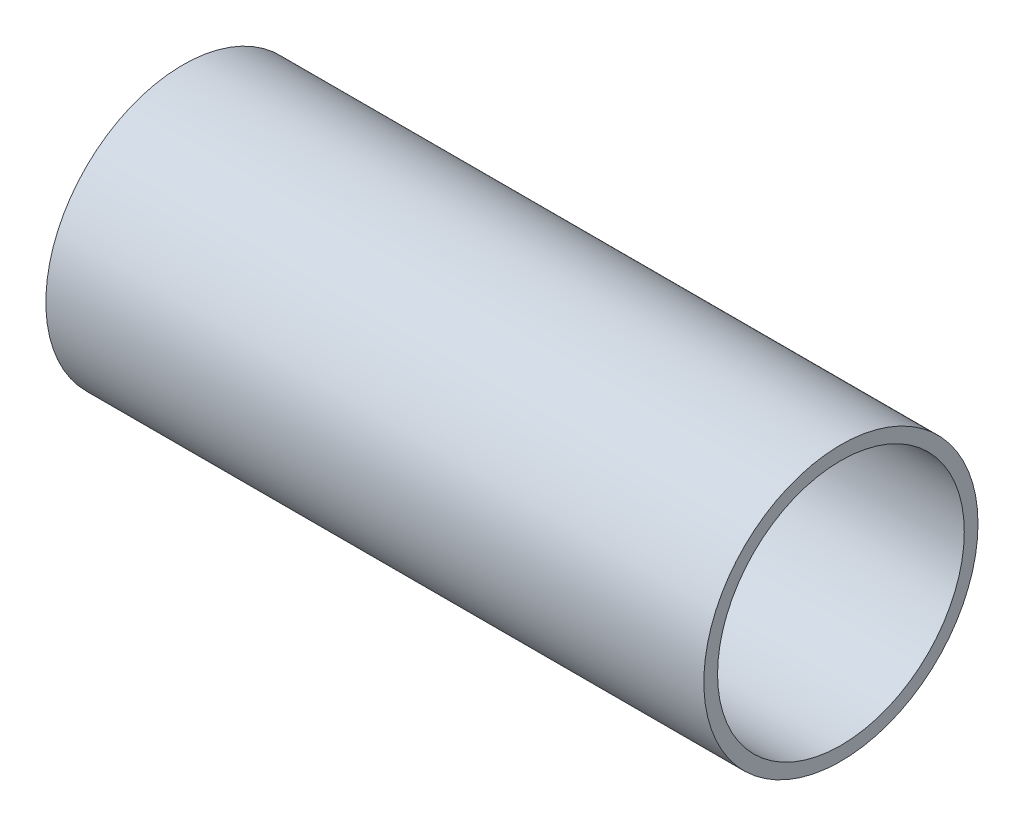
ISO-10303-21;
HEADER;
FILE_DESCRIPTION(('STEP AP214'),'2;1');
FILE_NAME('part.step','',(''),(''),'','','');
FILE_SCHEMA(('AUTOMOTIVE_DESIGN { 1 0 10303 214 1 1 1 1 }'));
ENDSEC;
DATA;
#1=APPLICATION_CONTEXT('core data for automotive mechanical design processes');
#2=APPLICATION_PROTOCOL_DEFINITION('international standard','automotive_design',2000,#1);
#3=PRODUCT_CONTEXT('',#1,'mechanical');
#4=PRODUCT('Part','Part','',(#3));
#5=PRODUCT_RELATED_PRODUCT_CATEGORY('part','',(#4));
#6=PRODUCT_DEFINITION_FORMATION('','',#4);
#7=PRODUCT_DEFINITION_CONTEXT('part definition',#1,'design');
#8=PRODUCT_DEFINITION('design','',#6,#7);
#9=PRODUCT_DEFINITION_SHAPE('','',#8);
#10=(LENGTH_UNIT() NAMED_UNIT(*) SI_UNIT(.MILLI.,.METRE.));
#11=(NAMED_UNIT(*) PLANE_ANGLE_UNIT() SI_UNIT($,.RADIAN.));
#12=(NAMED_UNIT(*) SI_UNIT($,.STERADIAN.) SOLID_ANGLE_UNIT());
#13=UNCERTAINTY_MEASURE_WITH_UNIT(LENGTH_MEASURE(1.E-05),#10,'distance_accuracy_value','');
#14=(GEOMETRIC_REPRESENTATION_CONTEXT(3) GLOBAL_UNCERTAINTY_ASSIGNED_CONTEXT((#13)) GLOBAL_UNIT_ASSIGNED_CONTEXT((#10,
#11,#12)) REPRESENTATION_CONTEXT('',''));
#15=CARTESIAN_POINT('',(0.,0.,0.));
#16=DIRECTION('',(0.,0.,1.));
#17=DIRECTION('',(1.,0.,0.));
#18=AXIS2_PLACEMENT_3D('',#15,#16,#17);
#19=CARTESIAN_POINT('',(120.,0.,0.));
#20=DIRECTION('',(1.,0.,0.));
#21=DIRECTION('',(0.,0.,-1.));
#22=AXIS2_PLACEMENT_3D('',#19,#20,#21);
#23=PLANE('',#22);
#24=CARTESIAN_POINT('',(120.,0.,0.));
#25=DIRECTION('',(1.,0.,0.));
#26=DIRECTION('',(0.,0.,-1.));
#27=AXIS2_PLACEMENT_3D('',#24,#25,#26);
#28=CIRCLE('',#27,25.);
#29=CARTESIAN_POINT('',(120.,0.,-25.));
#30=VERTEX_POINT('',#29);
#31=EDGE_CURVE('E10',#30,#30,#28,.T.);
#32=ORIENTED_EDGE('',*,*,#31,.T.);
#33=EDGE_LOOP('',(#32));
#34=FACE_BOUND('',#33,.T.);
#35=CARTESIAN_POINT('',(120.,0.,0.));
#36=DIRECTION('',(1.,0.,0.));
#37=DIRECTION('',(0.,0.,-1.));
#38=AXIS2_PLACEMENT_3D('',#35,#36,#37);
#39=CIRCLE('',#38,22.5);
#40=CARTESIAN_POINT('',(120.,0.,-22.5));
#41=VERTEX_POINT('',#40);
#42=EDGE_CURVE('E44',#41,#41,#39,.T.);
#43=ORIENTED_EDGE('',*,*,#42,.F.);
#44=EDGE_LOOP('',(#43));
#45=FACE_BOUND('',#44,.T.);
#46=ADVANCED_FACE('F33',(#34,#45),#23,.T.);
#47=CARTESIAN_POINT('',(0.,0.,0.));
#48=DIRECTION('',(1.,0.,0.));
#49=DIRECTION('',(0.,0.,-1.));
#50=AXIS2_PLACEMENT_3D('',#47,#48,#49);
#51=PLANE('',#50);
#52=CARTESIAN_POINT('',(0.,0.,0.));
#53=DIRECTION('',(1.,0.,0.));
#54=DIRECTION('',(0.,0.,-1.));
#55=AXIS2_PLACEMENT_3D('',#52,#53,#54);
#56=CIRCLE('',#55,25.);
#57=CARTESIAN_POINT('',(0.,0.,-25.));
#58=VERTEX_POINT('',#57);
#59=EDGE_CURVE('E37',#58,#58,#56,.T.);
#60=ORIENTED_EDGE('',*,*,#59,.F.);
#61=EDGE_LOOP('',(#60));
#62=FACE_BOUND('',#61,.T.);
#63=CARTESIAN_POINT('',(0.,0.,0.));
#64=DIRECTION('',(1.,0.,0.));
#65=DIRECTION('',(0.,0.,-1.));
#66=AXIS2_PLACEMENT_3D('',#63,#64,#65);
#67=CIRCLE('',#66,22.5);
#68=CARTESIAN_POINT('',(0.,0.,-22.5));
#69=VERTEX_POINT('',#68);
#70=EDGE_CURVE('E46',#69,#69,#67,.T.);
#71=ORIENTED_EDGE('',*,*,#70,.T.);
#72=EDGE_LOOP('',(#71));
#73=FACE_BOUND('',#72,.T.);
#74=ADVANCED_FACE('F56',(#62,#73),#51,.F.);
#75=CARTESIAN_POINT('',(120.,0.,0.));
#76=DIRECTION('',(-1.,0.,0.));
#77=DIRECTION('',(0.,0.,1.));
#78=AXIS2_PLACEMENT_3D('',#75,#76,#77);
#79=CYLINDRICAL_SURFACE('',#78,25.);
#80=ORIENTED_EDGE('',*,*,#31,.F.);
#81=EDGE_LOOP('',(#80));
#82=FACE_BOUND('',#81,.T.);
#83=ORIENTED_EDGE('',*,*,#59,.T.);
#84=EDGE_LOOP('',(#83));
#85=FACE_BOUND('',#84,.T.);
#86=ADVANCED_FACE('F35',(#82,#85),#79,.T.);
#87=CARTESIAN_POINT('',(120.,0.,0.));
#88=DIRECTION('',(-1.,0.,0.));
#89=DIRECTION('',(0.,0.,1.));
#90=AXIS2_PLACEMENT_3D('',#87,#88,#89);
#91=CYLINDRICAL_SURFACE('',#90,22.5);
#92=ORIENTED_EDGE('',*,*,#42,.T.);
#93=EDGE_LOOP('',(#92));
#94=FACE_BOUND('',#93,.T.);
#95=ORIENTED_EDGE('',*,*,#70,.F.);
#96=EDGE_LOOP('',(#95));
#97=FACE_BOUND('',#96,.T.);
#98=ADVANCED_FACE('F52',(#94,#97),#91,.F.);
#99=CLOSED_SHELL('',(#46,#74,#86,#98));
#100=MANIFOLD_SOLID_BREP('B2',#99);
#101=ADVANCED_BREP_SHAPE_REPRESENTATION('',(#18,#100),#14);
#102=SHAPE_DEFINITION_REPRESENTATION(#9,#101);
ENDSEC;
END-ISO-10303-21;
